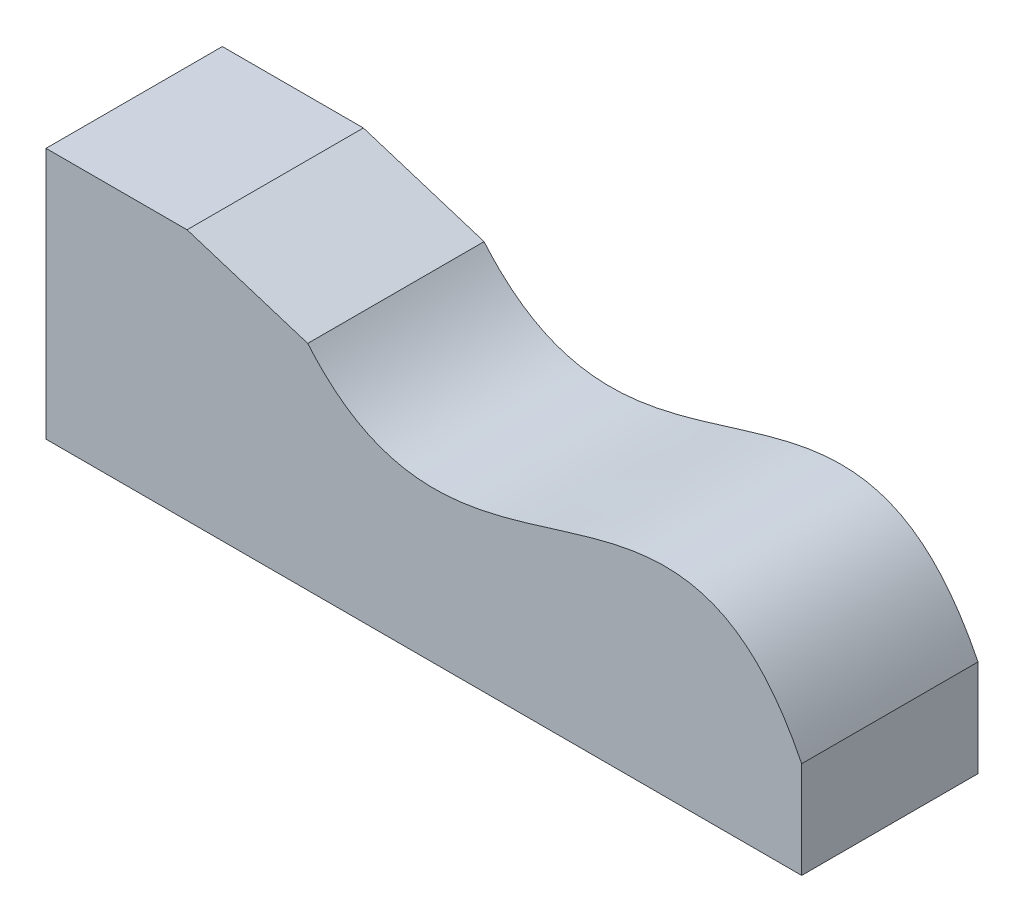
ISO-10303-21;
HEADER;
FILE_DESCRIPTION(('STEP AP214'),'2;1');
FILE_NAME('part.step','',(''),(''),'','','');
FILE_SCHEMA(('AUTOMOTIVE_DESIGN { 1 0 10303 214 1 1 1 1 }'));
ENDSEC;
DATA;
#1=APPLICATION_CONTEXT('core data for automotive mechanical design processes');
#2=APPLICATION_PROTOCOL_DEFINITION('international standard','automotive_design',2000,#1);
#3=PRODUCT_CONTEXT('',#1,'mechanical');
#4=PRODUCT('Part','Part','',(#3));
#5=PRODUCT_RELATED_PRODUCT_CATEGORY('part','',(#4));
#6=PRODUCT_DEFINITION_FORMATION('','',#4);
#7=PRODUCT_DEFINITION_CONTEXT('part definition',#1,'design');
#8=PRODUCT_DEFINITION('design','',#6,#7);
#9=PRODUCT_DEFINITION_SHAPE('','',#8);
#10=(LENGTH_UNIT() NAMED_UNIT(*) SI_UNIT(.MILLI.,.METRE.));
#11=(NAMED_UNIT(*) PLANE_ANGLE_UNIT() SI_UNIT($,.RADIAN.));
#12=(NAMED_UNIT(*) SI_UNIT($,.STERADIAN.) SOLID_ANGLE_UNIT());
#13=UNCERTAINTY_MEASURE_WITH_UNIT(LENGTH_MEASURE(1.E-05),#10,'distance_accuracy_value','');
#14=(GEOMETRIC_REPRESENTATION_CONTEXT(3) GLOBAL_UNCERTAINTY_ASSIGNED_CONTEXT((#13)) GLOBAL_UNIT_ASSIGNED_CONTEXT((#10,
#11,#12)) REPRESENTATION_CONTEXT('',''));
#15=CARTESIAN_POINT('',(0.,0.,0.));
#16=DIRECTION('',(0.,0.,1.));
#17=DIRECTION('',(1.,0.,0.));
#18=AXIS2_PLACEMENT_3D('',#15,#16,#17);
#19=CARTESIAN_POINT('',(150.,0.,35.));
#20=DIRECTION('',(0.,1.,0.));
#21=DIRECTION('',(0.,0.,1.));
#22=AXIS2_PLACEMENT_3D('',#19,#20,#21);
#23=PLANE('',#22);
#24=DIRECTION('',(1.,0.,0.));
#25=VECTOR('',#24,1.);
#26=CARTESIAN_POINT('',(150.,0.,0.));
#27=LINE('',#26,#25);
#28=CARTESIAN_POINT('',(0.,0.,0.));
#29=VERTEX_POINT('',#28);
#30=CARTESIAN_POINT('',(150.,0.,0.));
#31=VERTEX_POINT('',#30);
#32=EDGE_CURVE('E117',#29,#31,#27,.T.);
#33=ORIENTED_EDGE('',*,*,#32,.T.);
#34=DIRECTION('',(0.,0.,-1.));
#35=VECTOR('',#34,1.);
#36=CARTESIAN_POINT('',(150.,0.,35.));
#37=LINE('',#36,#35);
#38=CARTESIAN_POINT('',(150.,0.,35.));
#39=VERTEX_POINT('',#38);
#40=EDGE_CURVE('E11',#39,#31,#37,.T.);
#41=ORIENTED_EDGE('',*,*,#40,.F.);
#42=DIRECTION('',(1.,0.,0.));
#43=VECTOR('',#42,1.);
#44=CARTESIAN_POINT('',(150.,0.,35.));
#45=LINE('',#44,#43);
#46=CARTESIAN_POINT('',(0.,0.,35.));
#47=VERTEX_POINT('',#46);
#48=EDGE_CURVE('E132',#47,#39,#45,.T.);
#49=ORIENTED_EDGE('',*,*,#48,.F.);
#50=DIRECTION('',(0.,0.,-1.));
#51=VECTOR('',#50,1.);
#52=CARTESIAN_POINT('',(0.,0.,35.));
#53=LINE('',#52,#51);
#54=EDGE_CURVE('E113',#47,#29,#53,.T.);
#55=ORIENTED_EDGE('',*,*,#54,.T.);
#56=EDGE_LOOP('',(#33,#41,#49,#55));
#57=FACE_BOUND('',#56,.T.);
#58=ADVANCED_FACE('F33',(#57),#23,.F.);
#59=CARTESIAN_POINT('',(150.,19.2093771007255,35.));
#60=DIRECTION('',(-1.,0.,0.));
#61=DIRECTION('',(0.,0.,1.));
#62=AXIS2_PLACEMENT_3D('',#59,#60,#61);
#63=PLANE('',#62);
#64=DIRECTION('',(0.,1.,0.));
#65=VECTOR('',#64,1.);
#66=CARTESIAN_POINT('',(150.,19.2093771007255,0.));
#67=LINE('',#66,#65);
#68=CARTESIAN_POINT('',(150.,19.2093771007255,0.));
#69=VERTEX_POINT('',#68);
#70=EDGE_CURVE('E120',#31,#69,#67,.T.);
#71=ORIENTED_EDGE('',*,*,#70,.T.);
#72=DIRECTION('',(0.,0.,-1.));
#73=VECTOR('',#72,1.);
#74=CARTESIAN_POINT('',(150.,19.2093771007255,35.));
#75=LINE('',#74,#73);
#76=CARTESIAN_POINT('',(150.,19.2093771007255,35.));
#77=VERTEX_POINT('',#76);
#78=EDGE_CURVE('E41',#77,#69,#75,.T.);
#79=ORIENTED_EDGE('',*,*,#78,.F.);
#80=DIRECTION('',(0.,1.,0.));
#81=VECTOR('',#80,1.);
#82=CARTESIAN_POINT('',(150.,19.2093771007255,35.));
#83=LINE('',#82,#81);
#84=EDGE_CURVE('E86',#39,#77,#83,.T.);
#85=ORIENTED_EDGE('',*,*,#84,.F.);
#86=ORIENTED_EDGE('',*,*,#40,.T.);
#87=EDGE_LOOP('',(#71,#79,#85,#86));
#88=FACE_BOUND('',#87,.T.);
#89=ADVANCED_FACE('F156',(#88),#63,.F.);
#90=CARTESIAN_POINT('',(150.,19.2093771007255,35.));
#91=CARTESIAN_POINT('',(124.627264653736,70.2572465074095,35.));
#92=CARTESIAN_POINT('',(83.8970765159553,4.5560348674156,35.));
#93=CARTESIAN_POINT('',(51.956313103217,42.4432846902574,35.));
#94=B_SPLINE_CURVE_WITH_KNOTS('',3,(#90,#91,#92,#93),.UNSPECIFIED.,.F.,.F.,(4,4),(0.,1.),.UNSPECIFIED.);
#95=DIRECTION('',(0.,0.,-1.));
#96=VECTOR('',#95,1.);
#97=SURFACE_OF_LINEAR_EXTRUSION('',#94,#96);
#98=CARTESIAN_POINT('',(150.,19.2093771007255,0.));
#99=CARTESIAN_POINT('',(124.627264653736,70.2572465074095,0.));
#100=CARTESIAN_POINT('',(83.8970765159553,4.5560348674156,0.));
#101=CARTESIAN_POINT('',(51.956313103217,42.4432846902574,0.));
#102=B_SPLINE_CURVE_WITH_KNOTS('',3,(#98,#99,#100,#101),.UNSPECIFIED.,.F.,.F.,(4,4),(0.,1.),.UNSPECIFIED.);
#103=CARTESIAN_POINT('',(51.956313103217,42.4432846902574,0.));
#104=VERTEX_POINT('',#103);
#105=EDGE_CURVE('E122',#69,#104,#102,.T.);
#106=ORIENTED_EDGE('',*,*,#105,.T.);
#107=DIRECTION('',(0.,0.,-1.));
#108=VECTOR('',#107,1.);
#109=CARTESIAN_POINT('',(51.956313103217,42.4432846902574,35.));
#110=LINE('',#109,#108);
#111=CARTESIAN_POINT('',(51.956313103217,42.4432846902574,35.));
#112=VERTEX_POINT('',#111);
#113=EDGE_CURVE('E108',#112,#104,#110,.T.);
#114=ORIENTED_EDGE('',*,*,#113,.F.);
#115=EDGE_CURVE('E99',#77,#112,#94,.T.);
#116=ORIENTED_EDGE('',*,*,#115,.F.);
#117=ORIENTED_EDGE('',*,*,#78,.T.);
#118=EDGE_LOOP('',(#106,#114,#116,#117));
#119=FACE_BOUND('',#118,.T.);
#120=ADVANCED_FACE('F138',(#119),#97,.F.);
#121=CARTESIAN_POINT('',(28.,50.,35.));
#122=DIRECTION('',(-0.300825968939671,-0.953679053147079,0.));
#123=DIRECTION('',(0.953679053147079,-0.300825968939671,0.));
#124=AXIS2_PLACEMENT_3D('',#121,#122,#123);
#125=PLANE('',#124);
#126=DIRECTION('',(-0.953679053147079,0.300825968939671,0.));
#127=VECTOR('',#126,1.);
#128=CARTESIAN_POINT('',(28.,50.,0.));
#129=LINE('',#128,#127);
#130=CARTESIAN_POINT('',(28.,50.,0.));
#131=VERTEX_POINT('',#130);
#132=EDGE_CURVE('E107',#104,#131,#129,.T.);
#133=ORIENTED_EDGE('',*,*,#132,.T.);
#134=DIRECTION('',(0.,0.,-1.));
#135=VECTOR('',#134,1.);
#136=CARTESIAN_POINT('',(28.,50.,35.));
#137=LINE('',#136,#135);
#138=CARTESIAN_POINT('',(28.,50.,35.));
#139=VERTEX_POINT('',#138);
#140=EDGE_CURVE('E104',#139,#131,#137,.T.);
#141=ORIENTED_EDGE('',*,*,#140,.F.);
#142=DIRECTION('',(-0.953679053147079,0.300825968939671,0.));
#143=VECTOR('',#142,1.);
#144=CARTESIAN_POINT('',(28.,50.,35.));
#145=LINE('',#144,#143);
#146=EDGE_CURVE('E93',#112,#139,#145,.T.);
#147=ORIENTED_EDGE('',*,*,#146,.F.);
#148=ORIENTED_EDGE('',*,*,#113,.T.);
#149=EDGE_LOOP('',(#133,#141,#147,#148));
#150=FACE_BOUND('',#149,.T.);
#151=ADVANCED_FACE('F105',(#150),#125,.F.);
#152=CARTESIAN_POINT('',(0.,50.,35.));
#153=DIRECTION('',(0.,-1.,0.));
#154=DIRECTION('',(0.,0.,-1.));
#155=AXIS2_PLACEMENT_3D('',#152,#153,#154);
#156=PLANE('',#155);
#157=DIRECTION('',(-1.,0.,0.));
#158=VECTOR('',#157,1.);
#159=CARTESIAN_POINT('',(0.,50.,0.));
#160=LINE('',#159,#158);
#161=CARTESIAN_POINT('',(0.,50.,0.));
#162=VERTEX_POINT('',#161);
#163=EDGE_CURVE('E72',#131,#162,#160,.T.);
#164=ORIENTED_EDGE('',*,*,#163,.T.);
#165=DIRECTION('',(0.,0.,-1.));
#166=VECTOR('',#165,1.);
#167=CARTESIAN_POINT('',(0.,50.,35.));
#168=LINE('',#167,#166);
#169=CARTESIAN_POINT('',(0.,50.,35.));
#170=VERTEX_POINT('',#169);
#171=EDGE_CURVE('E109',#170,#162,#168,.T.);
#172=ORIENTED_EDGE('',*,*,#171,.F.);
#173=DIRECTION('',(-1.,0.,0.));
#174=VECTOR('',#173,1.);
#175=CARTESIAN_POINT('',(0.,50.,35.));
#176=LINE('',#175,#174);
#177=EDGE_CURVE('E97',#139,#170,#176,.T.);
#178=ORIENTED_EDGE('',*,*,#177,.F.);
#179=ORIENTED_EDGE('',*,*,#140,.T.);
#180=EDGE_LOOP('',(#164,#172,#178,#179));
#181=FACE_BOUND('',#180,.T.);
#182=ADVANCED_FACE('F111',(#181),#156,.F.);
#183=CARTESIAN_POINT('',(0.,0.,35.));
#184=DIRECTION('',(1.,0.,0.));
#185=DIRECTION('',(0.,0.,-1.));
#186=AXIS2_PLACEMENT_3D('',#183,#184,#185);
#187=PLANE('',#186);
#188=DIRECTION('',(0.,-1.,0.));
#189=VECTOR('',#188,1.);
#190=CARTESIAN_POINT('',(0.,0.,0.));
#191=LINE('',#190,#189);
#192=EDGE_CURVE('E78',#162,#29,#191,.T.);
#193=ORIENTED_EDGE('',*,*,#192,.T.);
#194=ORIENTED_EDGE('',*,*,#54,.F.);
#195=DIRECTION('',(0.,-1.,0.));
#196=VECTOR('',#195,1.);
#197=CARTESIAN_POINT('',(0.,0.,35.));
#198=LINE('',#197,#196);
#199=EDGE_CURVE('E49',#170,#47,#198,.T.);
#200=ORIENTED_EDGE('',*,*,#199,.F.);
#201=ORIENTED_EDGE('',*,*,#171,.T.);
#202=EDGE_LOOP('',(#193,#194,#200,#201));
#203=FACE_BOUND('',#202,.T.);
#204=ADVANCED_FACE('F145',(#203),#187,.F.);
#205=CARTESIAN_POINT('',(103.441167076536,35.7615632394323,35.));
#206=DIRECTION('',(0.,0.,-1.));
#207=DIRECTION('',(-1.,0.,0.));
#208=AXIS2_PLACEMENT_3D('',#205,#206,#207);
#209=PLANE('',#208);
#210=ORIENTED_EDGE('',*,*,#48,.T.);
#211=ORIENTED_EDGE('',*,*,#84,.T.);
#212=ORIENTED_EDGE('',*,*,#115,.T.);
#213=ORIENTED_EDGE('',*,*,#146,.T.);
#214=ORIENTED_EDGE('',*,*,#177,.T.);
#215=ORIENTED_EDGE('',*,*,#199,.T.);
#216=EDGE_LOOP('',(#210,#211,#212,#213,#214,#215));
#217=FACE_BOUND('',#216,.T.);
#218=ADVANCED_FACE('F95',(#217),#209,.F.);
#219=CARTESIAN_POINT('',(103.441167076536,35.7615632394323,0.));
#220=DIRECTION('',(0.,0.,-1.));
#221=DIRECTION('',(-1.,0.,0.));
#222=AXIS2_PLACEMENT_3D('',#219,#220,#221);
#223=PLANE('',#222);
#224=ORIENTED_EDGE('',*,*,#32,.F.);
#225=ORIENTED_EDGE('',*,*,#192,.F.);
#226=ORIENTED_EDGE('',*,*,#163,.F.);
#227=ORIENTED_EDGE('',*,*,#132,.F.);
#228=ORIENTED_EDGE('',*,*,#105,.F.);
#229=ORIENTED_EDGE('',*,*,#70,.F.);
#230=EDGE_LOOP('',(#224,#225,#226,#227,#228,#229));
#231=FACE_BOUND('',#230,.T.);
#232=ADVANCED_FACE('F141',(#231),#223,.T.);
#233=CLOSED_SHELL('',(#58,#89,#120,#151,#182,#204,#218,#232));
#234=MANIFOLD_SOLID_BREP('B2',#233);
#235=ADVANCED_BREP_SHAPE_REPRESENTATION('',(#18,#234),#14);
#236=SHAPE_DEFINITION_REPRESENTATION(#9,#235);
ENDSEC;
END-ISO-10303-21;
